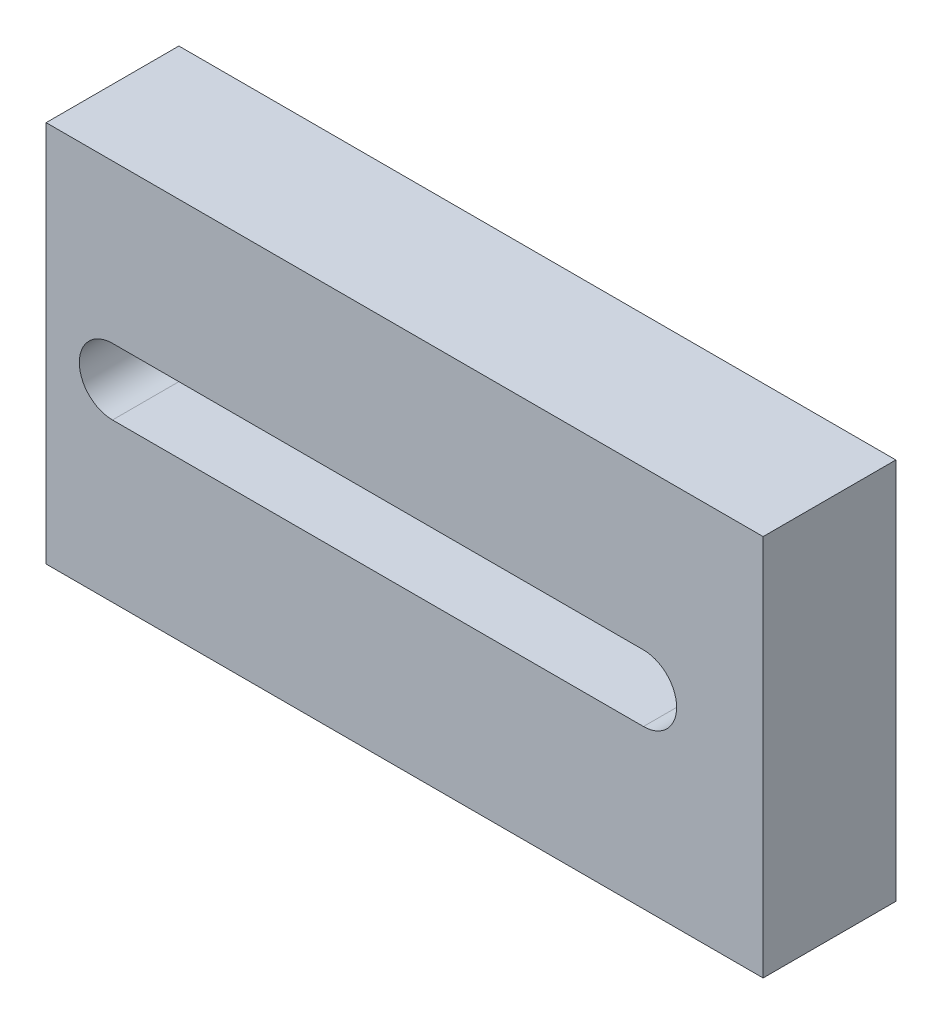
ISO-10303-21;
HEADER;
FILE_DESCRIPTION(('STEP AP214'),'2;1');
FILE_NAME('part.step','',(''),(''),'','','');
FILE_SCHEMA(('AUTOMOTIVE_DESIGN { 1 0 10303 214 1 1 1 1 }'));
ENDSEC;
DATA;
#1=APPLICATION_CONTEXT('core data for automotive mechanical design processes');
#2=APPLICATION_PROTOCOL_DEFINITION('international standard','automotive_design',2000,#1);
#3=PRODUCT_CONTEXT('',#1,'mechanical');
#4=PRODUCT('Part','Part','',(#3));
#5=PRODUCT_RELATED_PRODUCT_CATEGORY('part','',(#4));
#6=PRODUCT_DEFINITION_FORMATION('','',#4);
#7=PRODUCT_DEFINITION_CONTEXT('part definition',#1,'design');
#8=PRODUCT_DEFINITION('design','',#6,#7);
#9=PRODUCT_DEFINITION_SHAPE('','',#8);
#10=(LENGTH_UNIT() NAMED_UNIT(*) SI_UNIT(.MILLI.,.METRE.));
#11=(NAMED_UNIT(*) PLANE_ANGLE_UNIT() SI_UNIT($,.RADIAN.));
#12=(NAMED_UNIT(*) SI_UNIT($,.STERADIAN.) SOLID_ANGLE_UNIT());
#13=UNCERTAINTY_MEASURE_WITH_UNIT(LENGTH_MEASURE(1.E-05),#10,'distance_accuracy_value','');
#14=(GEOMETRIC_REPRESENTATION_CONTEXT(3) GLOBAL_UNCERTAINTY_ASSIGNED_CONTEXT((#13)) GLOBAL_UNIT_ASSIGNED_CONTEXT((#10,
#11,#12)) REPRESENTATION_CONTEXT('',''));
#15=CARTESIAN_POINT('',(0.,0.,0.));
#16=DIRECTION('',(0.,0.,1.));
#17=DIRECTION('',(1.,0.,0.));
#18=AXIS2_PLACEMENT_3D('',#15,#16,#17);
#19=CARTESIAN_POINT('',(0.,0.,6.35));
#20=DIRECTION('',(0.,0.,-1.));
#21=DIRECTION('',(-1.,0.,0.));
#22=AXIS2_PLACEMENT_3D('',#19,#20,#21);
#23=PLANE('',#22);
#24=DIRECTION('',(0.,-1.,0.));
#25=VECTOR('',#24,1.);
#26=CARTESIAN_POINT('',(6576.96314933089,3567.46957804977,6.35));
#27=LINE('',#26,#25);
#28=CARTESIAN_POINT('',(6576.96314933089,3585.75778924036,6.35));
#29=VERTEX_POINT('',#28);
#30=CARTESIAN_POINT('',(6576.96314933089,3567.46957804977,6.35));
#31=VERTEX_POINT('',#30);
#32=EDGE_CURVE('E134',#29,#31,#27,.T.);
#33=ORIENTED_EDGE('',*,*,#32,.T.);
#34=DIRECTION('',(0.999999999999689,7.89052989773924E-07,0.));
#35=VECTOR('',#34,1.);
#36=CARTESIAN_POINT('',(6576.96314933089,3567.46957804977,6.35));
#37=LINE('',#36,#35);
#38=CARTESIAN_POINT('',(6611.26329308743,3567.4696051144,6.35));
#39=VERTEX_POINT('',#38);
#40=EDGE_CURVE('E137',#31,#39,#37,.T.);
#41=ORIENTED_EDGE('',*,*,#40,.T.);
#42=DIRECTION('',(0.,1.,0.));
#43=VECTOR('',#42,1.);
#44=CARTESIAN_POINT('',(6611.26329308743,3567.4696051144,6.35));
#45=LINE('',#44,#43);
#46=CARTESIAN_POINT('',(6611.26329308743,3585.75778924036,6.35));
#47=VERTEX_POINT('',#46);
#48=EDGE_CURVE('E140',#39,#47,#45,.T.);
#49=ORIENTED_EDGE('',*,*,#48,.T.);
#50=DIRECTION('',(-1.,0.,0.));
#51=VECTOR('',#50,1.);
#52=CARTESIAN_POINT('',(6576.96314933089,3585.75778924036,6.35));
#53=LINE('',#52,#51);
#54=EDGE_CURVE('E142',#47,#29,#53,.T.);
#55=ORIENTED_EDGE('',*,*,#54,.T.);
#56=EDGE_LOOP('',(#33,#41,#49,#55));
#57=FACE_BOUND('',#56,.T.);
#58=CARTESIAN_POINT('',(6580.13814933089,3576.61368364507,6.35));
#59=DIRECTION('',(0.,0.,1.));
#60=DIRECTION('',(1.,0.,0.));
#61=AXIS2_PLACEMENT_3D('',#58,#59,#60);
#62=CIRCLE('',#61,1.58749999999985);
#63=CARTESIAN_POINT('',(6580.13814933089,3578.20118364507,6.35));
#64=VERTEX_POINT('',#63);
#65=CARTESIAN_POINT('',(6580.13814933089,3575.02618364507,6.35));
#66=VERTEX_POINT('',#65);
#67=EDGE_CURVE('E98',#64,#66,#62,.T.);
#68=ORIENTED_EDGE('',*,*,#67,.F.);
#69=DIRECTION('',(-1.,0.,0.));
#70=VECTOR('',#69,1.);
#71=CARTESIAN_POINT('',(6580.13814933089,3578.20118364507,6.35));
#72=LINE('',#71,#70);
#73=CARTESIAN_POINT('',(6605.53814933089,3578.20118364507,6.35));
#74=VERTEX_POINT('',#73);
#75=EDGE_CURVE('E120',#74,#64,#72,.T.);
#76=ORIENTED_EDGE('',*,*,#75,.F.);
#77=CARTESIAN_POINT('',(6605.53814933089,3576.61368364507,6.35));
#78=DIRECTION('',(0.,0.,1.));
#79=DIRECTION('',(1.,0.,0.));
#80=AXIS2_PLACEMENT_3D('',#77,#78,#79);
#81=CIRCLE('',#80,1.58749999999985);
#82=CARTESIAN_POINT('',(6605.53814933089,3575.02618364507,6.35));
#83=VERTEX_POINT('',#82);
#84=EDGE_CURVE('E118',#83,#74,#81,.T.);
#85=ORIENTED_EDGE('',*,*,#84,.F.);
#86=DIRECTION('',(1.,0.,0.));
#87=VECTOR('',#86,1.);
#88=CARTESIAN_POINT('',(6580.13814933089,3575.02618364507,6.35));
#89=LINE('',#88,#87);
#90=EDGE_CURVE('E106',#66,#83,#89,.T.);
#91=ORIENTED_EDGE('',*,*,#90,.F.);
#92=EDGE_LOOP('',(#68,#76,#85,#91));
#93=FACE_BOUND('',#92,.T.);
#94=ADVANCED_FACE('F33',(#57,#93),#23,.F.);
#95=CARTESIAN_POINT('',(0.,0.,0.));
#96=DIRECTION('',(0.,0.,-1.));
#97=DIRECTION('',(-1.,0.,0.));
#98=AXIS2_PLACEMENT_3D('',#95,#96,#97);
#99=PLANE('',#98);
#100=DIRECTION('',(0.,-1.,0.));
#101=VECTOR('',#100,1.);
#102=CARTESIAN_POINT('',(6576.96314933089,3567.46957804977,0.));
#103=LINE('',#102,#101);
#104=CARTESIAN_POINT('',(6576.96314933089,3585.75778924036,0.));
#105=VERTEX_POINT('',#104);
#106=CARTESIAN_POINT('',(6576.96314933089,3567.46957804977,0.));
#107=VERTEX_POINT('',#106);
#108=EDGE_CURVE('E114',#105,#107,#103,.T.);
#109=ORIENTED_EDGE('',*,*,#108,.F.);
#110=DIRECTION('',(-1.,0.,0.));
#111=VECTOR('',#110,1.);
#112=CARTESIAN_POINT('',(6576.96314933089,3585.75778924036,0.));
#113=LINE('',#112,#111);
#114=CARTESIAN_POINT('',(6611.26329308743,3585.75778924036,0.));
#115=VERTEX_POINT('',#114);
#116=EDGE_CURVE('E138',#115,#105,#113,.T.);
#117=ORIENTED_EDGE('',*,*,#116,.F.);
#118=DIRECTION('',(0.,1.,0.));
#119=VECTOR('',#118,1.);
#120=CARTESIAN_POINT('',(6611.26329308743,3567.4696051144,0.));
#121=LINE('',#120,#119);
#122=CARTESIAN_POINT('',(6611.26329308743,3567.4696051144,0.));
#123=VERTEX_POINT('',#122);
#124=EDGE_CURVE('E149',#123,#115,#121,.T.);
#125=ORIENTED_EDGE('',*,*,#124,.F.);
#126=DIRECTION('',(0.999999999999689,7.89052989773924E-07,0.));
#127=VECTOR('',#126,1.);
#128=CARTESIAN_POINT('',(6576.96314933089,3567.46957804977,0.));
#129=LINE('',#128,#127);
#130=EDGE_CURVE('E147',#107,#123,#129,.T.);
#131=ORIENTED_EDGE('',*,*,#130,.F.);
#132=EDGE_LOOP('',(#109,#117,#125,#131));
#133=FACE_BOUND('',#132,.T.);
#134=DIRECTION('',(-1.,0.,0.));
#135=VECTOR('',#134,1.);
#136=CARTESIAN_POINT('',(6580.13814933089,3578.20118364507,0.));
#137=LINE('',#136,#135);
#138=CARTESIAN_POINT('',(6605.53814933089,3578.20118364507,0.));
#139=VERTEX_POINT('',#138);
#140=CARTESIAN_POINT('',(6580.13814933089,3578.20118364507,0.));
#141=VERTEX_POINT('',#140);
#142=EDGE_CURVE('E107',#139,#141,#137,.T.);
#143=ORIENTED_EDGE('',*,*,#142,.T.);
#144=CARTESIAN_POINT('',(6580.13814933089,3576.61368364507,0.));
#145=DIRECTION('',(0.,0.,1.));
#146=DIRECTION('',(1.,0.,0.));
#147=AXIS2_PLACEMENT_3D('',#144,#145,#146);
#148=CIRCLE('',#147,1.58749999999985);
#149=CARTESIAN_POINT('',(6580.13814933089,3575.02618364507,0.));
#150=VERTEX_POINT('',#149);
#151=EDGE_CURVE('E56',#141,#150,#148,.T.);
#152=ORIENTED_EDGE('',*,*,#151,.T.);
#153=DIRECTION('',(1.,0.,0.));
#154=VECTOR('',#153,1.);
#155=CARTESIAN_POINT('',(6580.13814933089,3575.02618364507,0.));
#156=LINE('',#155,#154);
#157=CARTESIAN_POINT('',(6605.53814933089,3575.02618364507,0.));
#158=VERTEX_POINT('',#157);
#159=EDGE_CURVE('E113',#150,#158,#156,.T.);
#160=ORIENTED_EDGE('',*,*,#159,.T.);
#161=CARTESIAN_POINT('',(6605.53814933089,3576.61368364507,0.));
#162=DIRECTION('',(0.,0.,1.));
#163=DIRECTION('',(1.,0.,0.));
#164=AXIS2_PLACEMENT_3D('',#161,#162,#163);
#165=CIRCLE('',#164,1.58749999999985);
#166=EDGE_CURVE('E126',#158,#139,#165,.T.);
#167=ORIENTED_EDGE('',*,*,#166,.T.);
#168=EDGE_LOOP('',(#143,#152,#160,#167));
#169=FACE_BOUND('',#168,.T.);
#170=ADVANCED_FACE('F167',(#133,#169),#99,.T.);
#171=CARTESIAN_POINT('',(6576.96314933089,3567.46957804977,6.35));
#172=DIRECTION('',(1.,0.,0.));
#173=DIRECTION('',(0.,0.,-1.));
#174=AXIS2_PLACEMENT_3D('',#171,#172,#173);
#175=PLANE('',#174);
#176=ORIENTED_EDGE('',*,*,#108,.T.);
#177=DIRECTION('',(0.,0.,-1.));
#178=VECTOR('',#177,1.);
#179=CARTESIAN_POINT('',(6576.96314933089,3567.46957804977,6.35));
#180=LINE('',#179,#178);
#181=EDGE_CURVE('E11',#31,#107,#180,.T.);
#182=ORIENTED_EDGE('',*,*,#181,.F.);
#183=ORIENTED_EDGE('',*,*,#32,.F.);
#184=DIRECTION('',(0.,0.,-1.));
#185=VECTOR('',#184,1.);
#186=CARTESIAN_POINT('',(6576.96314933089,3585.75778924036,6.35));
#187=LINE('',#186,#185);
#188=EDGE_CURVE('E144',#29,#105,#187,.T.);
#189=ORIENTED_EDGE('',*,*,#188,.T.);
#190=EDGE_LOOP('',(#176,#182,#183,#189));
#191=FACE_BOUND('',#190,.T.);
#192=ADVANCED_FACE('F35',(#191),#175,.F.);
#193=CARTESIAN_POINT('',(6576.96314933089,3567.46957804977,6.35));
#194=DIRECTION('',(-7.89052989773924E-07,0.999999999999689,0.));
#195=DIRECTION('',(-0.999999999999689,-7.89052989773924E-07,0.));
#196=AXIS2_PLACEMENT_3D('',#193,#194,#195);
#197=PLANE('',#196);
#198=ORIENTED_EDGE('',*,*,#130,.T.);
#199=DIRECTION('',(0.,0.,-1.));
#200=VECTOR('',#199,1.);
#201=CARTESIAN_POINT('',(6611.26329308743,3567.4696051144,6.35));
#202=LINE('',#201,#200);
#203=EDGE_CURVE('E41',#39,#123,#202,.T.);
#204=ORIENTED_EDGE('',*,*,#203,.F.);
#205=ORIENTED_EDGE('',*,*,#40,.F.);
#206=ORIENTED_EDGE('',*,*,#181,.T.);
#207=EDGE_LOOP('',(#198,#204,#205,#206));
#208=FACE_BOUND('',#207,.T.);
#209=ADVANCED_FACE('F177',(#208),#197,.F.);
#210=CARTESIAN_POINT('',(6611.26329308743,3567.4696051144,6.35));
#211=DIRECTION('',(-1.,0.,0.));
#212=DIRECTION('',(0.,0.,1.));
#213=AXIS2_PLACEMENT_3D('',#210,#211,#212);
#214=PLANE('',#213);
#215=ORIENTED_EDGE('',*,*,#124,.T.);
#216=DIRECTION('',(0.,0.,-1.));
#217=VECTOR('',#216,1.);
#218=CARTESIAN_POINT('',(6611.26329308743,3585.75778924036,6.35));
#219=LINE('',#218,#217);
#220=EDGE_CURVE('E154',#47,#115,#219,.T.);
#221=ORIENTED_EDGE('',*,*,#220,.F.);
#222=ORIENTED_EDGE('',*,*,#48,.F.);
#223=ORIENTED_EDGE('',*,*,#203,.T.);
#224=EDGE_LOOP('',(#215,#221,#222,#223));
#225=FACE_BOUND('',#224,.T.);
#226=ADVANCED_FACE('F161',(#225),#214,.F.);
#227=CARTESIAN_POINT('',(6576.96314933089,3585.75778924036,6.35));
#228=DIRECTION('',(0.,-1.,0.));
#229=DIRECTION('',(0.,0.,-1.));
#230=AXIS2_PLACEMENT_3D('',#227,#228,#229);
#231=PLANE('',#230);
#232=ORIENTED_EDGE('',*,*,#116,.T.);
#233=ORIENTED_EDGE('',*,*,#188,.F.);
#234=ORIENTED_EDGE('',*,*,#54,.F.);
#235=ORIENTED_EDGE('',*,*,#220,.T.);
#236=EDGE_LOOP('',(#232,#233,#234,#235));
#237=FACE_BOUND('',#236,.T.);
#238=ADVANCED_FACE('F171',(#237),#231,.F.);
#239=CARTESIAN_POINT('',(6580.13814933089,3576.61368364507,6.35));
#240=DIRECTION('',(0.,0.,-1.));
#241=DIRECTION('',(-1.,0.,0.));
#242=AXIS2_PLACEMENT_3D('',#239,#240,#241);
#243=CYLINDRICAL_SURFACE('',#242,1.58749999999985);
#244=ORIENTED_EDGE('',*,*,#151,.F.);
#245=DIRECTION('',(0.,0.,-1.));
#246=VECTOR('',#245,1.);
#247=CARTESIAN_POINT('',(6580.13814933089,3578.20118364507,6.35));
#248=LINE('',#247,#246);
#249=EDGE_CURVE('E102',#64,#141,#248,.T.);
#250=ORIENTED_EDGE('',*,*,#249,.F.);
#251=ORIENTED_EDGE('',*,*,#67,.T.);
#252=DIRECTION('',(0.,0.,-1.));
#253=VECTOR('',#252,1.);
#254=CARTESIAN_POINT('',(6580.13814933089,3575.02618364507,6.35));
#255=LINE('',#254,#253);
#256=EDGE_CURVE('E101',#66,#150,#255,.T.);
#257=ORIENTED_EDGE('',*,*,#256,.T.);
#258=EDGE_LOOP('',(#244,#250,#251,#257));
#259=FACE_BOUND('',#258,.T.);
#260=ADVANCED_FACE('F100',(#259),#243,.F.);
#261=CARTESIAN_POINT('',(6580.13814933089,3575.02618364507,6.35));
#262=DIRECTION('',(0.,1.,0.));
#263=DIRECTION('',(0.,0.,1.));
#264=AXIS2_PLACEMENT_3D('',#261,#262,#263);
#265=PLANE('',#264);
#266=ORIENTED_EDGE('',*,*,#159,.F.);
#267=ORIENTED_EDGE('',*,*,#256,.F.);
#268=ORIENTED_EDGE('',*,*,#90,.T.);
#269=DIRECTION('',(0.,0.,-1.));
#270=VECTOR('',#269,1.);
#271=CARTESIAN_POINT('',(6605.53814933089,3575.02618364507,6.35));
#272=LINE('',#271,#270);
#273=EDGE_CURVE('E115',#83,#158,#272,.T.);
#274=ORIENTED_EDGE('',*,*,#273,.T.);
#275=EDGE_LOOP('',(#266,#267,#268,#274));
#276=FACE_BOUND('',#275,.T.);
#277=ADVANCED_FACE('F110',(#276),#265,.T.);
#278=CARTESIAN_POINT('',(6605.53814933089,3576.61368364507,6.35));
#279=DIRECTION('',(0.,0.,-1.));
#280=DIRECTION('',(-1.,0.,0.));
#281=AXIS2_PLACEMENT_3D('',#278,#279,#280);
#282=CYLINDRICAL_SURFACE('',#281,1.58749999999985);
#283=ORIENTED_EDGE('',*,*,#166,.F.);
#284=ORIENTED_EDGE('',*,*,#273,.F.);
#285=ORIENTED_EDGE('',*,*,#84,.T.);
#286=DIRECTION('',(0.,0.,-1.));
#287=VECTOR('',#286,1.);
#288=CARTESIAN_POINT('',(6605.53814933089,3578.20118364507,6.35));
#289=LINE('',#288,#287);
#290=EDGE_CURVE('E48',#74,#139,#289,.T.);
#291=ORIENTED_EDGE('',*,*,#290,.T.);
#292=EDGE_LOOP('',(#283,#284,#285,#291));
#293=FACE_BOUND('',#292,.T.);
#294=ADVANCED_FACE('F200',(#293),#282,.F.);
#295=CARTESIAN_POINT('',(6580.13814933089,3578.20118364507,6.35));
#296=DIRECTION('',(0.,-1.,0.));
#297=DIRECTION('',(0.,0.,-1.));
#298=AXIS2_PLACEMENT_3D('',#295,#296,#297);
#299=PLANE('',#298);
#300=ORIENTED_EDGE('',*,*,#142,.F.);
#301=ORIENTED_EDGE('',*,*,#290,.F.);
#302=ORIENTED_EDGE('',*,*,#75,.T.);
#303=ORIENTED_EDGE('',*,*,#249,.T.);
#304=EDGE_LOOP('',(#300,#301,#302,#303));
#305=FACE_BOUND('',#304,.T.);
#306=ADVANCED_FACE('F204',(#305),#299,.T.);
#307=CLOSED_SHELL('',(#94,#170,#192,#209,#226,#238,#260,#277,#294,#306));
#308=MANIFOLD_SOLID_BREP('B2',#307);
#309=ADVANCED_BREP_SHAPE_REPRESENTATION('',(#18,#308),#14);
#310=SHAPE_DEFINITION_REPRESENTATION(#9,#309);
ENDSEC;
END-ISO-10303-21;
